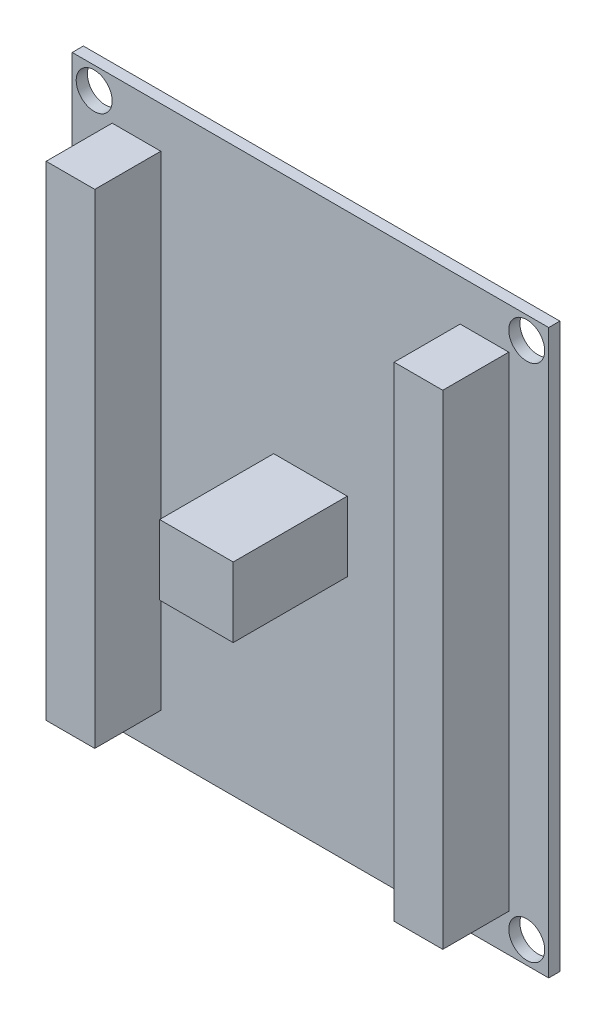
ISO-10303-21;
HEADER;
FILE_DESCRIPTION(('STEP AP214'),'2;1');
FILE_NAME('part.step','',(''),(''),'','','');
FILE_SCHEMA(('AUTOMOTIVE_DESIGN { 1 0 10303 214 1 1 1 1 }'));
ENDSEC;
DATA;
#1=APPLICATION_CONTEXT('core data for automotive mechanical design processes');
#2=APPLICATION_PROTOCOL_DEFINITION('international standard','automotive_design',2000,#1);
#3=PRODUCT_CONTEXT('',#1,'mechanical');
#4=PRODUCT('Part','Part','',(#3));
#5=PRODUCT_RELATED_PRODUCT_CATEGORY('part','',(#4));
#6=PRODUCT_DEFINITION_FORMATION('','',#4);
#7=PRODUCT_DEFINITION_CONTEXT('part definition',#1,'design');
#8=PRODUCT_DEFINITION('design','',#6,#7);
#9=PRODUCT_DEFINITION_SHAPE('','',#8);
#10=(LENGTH_UNIT() NAMED_UNIT(*) SI_UNIT(.MILLI.,.METRE.));
#11=(NAMED_UNIT(*) PLANE_ANGLE_UNIT() SI_UNIT($,.RADIAN.));
#12=(NAMED_UNIT(*) SI_UNIT($,.STERADIAN.) SOLID_ANGLE_UNIT());
#13=UNCERTAINTY_MEASURE_WITH_UNIT(LENGTH_MEASURE(1.E-05),#10,'distance_accuracy_value','');
#14=(GEOMETRIC_REPRESENTATION_CONTEXT(3) GLOBAL_UNCERTAINTY_ASSIGNED_CONTEXT((#13)) GLOBAL_UNIT_ASSIGNED_CONTEXT((#10,
#11,#12)) REPRESENTATION_CONTEXT('',''));
#15=CARTESIAN_POINT('',(0.,0.,0.));
#16=DIRECTION('',(0.,0.,1.));
#17=DIRECTION('',(1.,0.,0.));
#18=AXIS2_PLACEMENT_3D('',#15,#16,#17);
#19=CARTESIAN_POINT('',(0.,0.,1.55));
#20=DIRECTION('',(0.,0.,-1.));
#21=DIRECTION('',(-1.,0.,0.));
#22=AXIS2_PLACEMENT_3D('',#19,#20,#21);
#23=PLANE('',#22);
#24=DIRECTION('',(0.,1.,0.));
#25=VECTOR('',#24,1.);
#26=CARTESIAN_POINT('',(-5.11643955048181,0.,1.55));
#27=LINE('',#26,#25);
#28=CARTESIAN_POINT('',(-5.11643955048181,-4.85539671627351,1.55));
#29=VERTEX_POINT('',#28);
#30=CARTESIAN_POINT('',(-5.11643955048181,4.85539671627351,1.55));
#31=VERTEX_POINT('',#30);
#32=EDGE_CURVE('E64',#29,#31,#27,.T.);
#33=ORIENTED_EDGE('',*,*,#32,.T.);
#34=DIRECTION('',(1.,0.,0.));
#35=VECTOR('',#34,1.);
#36=CARTESIAN_POINT('',(0.,4.85539671627351,1.55));
#37=LINE('',#36,#35);
#38=CARTESIAN_POINT('',(5.11643955048181,4.85539671627351,1.55));
#39=VERTEX_POINT('',#38);
#40=EDGE_CURVE('E166',#31,#39,#37,.T.);
#41=ORIENTED_EDGE('',*,*,#40,.T.);
#42=DIRECTION('',(0.,1.,0.));
#43=VECTOR('',#42,1.);
#44=CARTESIAN_POINT('',(5.11643955048181,0.,1.55));
#45=LINE('',#44,#43);
#46=CARTESIAN_POINT('',(5.11643955048181,-4.85539671627351,1.55));
#47=VERTEX_POINT('',#46);
#48=EDGE_CURVE('E181',#47,#39,#45,.T.);
#49=ORIENTED_EDGE('',*,*,#48,.F.);
#50=DIRECTION('',(1.,0.,0.));
#51=VECTOR('',#50,1.);
#52=CARTESIAN_POINT('',(0.,-4.85539671627351,1.55));
#53=LINE('',#52,#51);
#54=EDGE_CURVE('E69',#29,#47,#53,.T.);
#55=ORIENTED_EDGE('',*,*,#54,.F.);
#56=EDGE_LOOP('',(#33,#41,#49,#55));
#57=FACE_BOUND('',#56,.T.);
#58=DIRECTION('',(0.,1.,0.));
#59=VECTOR('',#58,1.);
#60=CARTESIAN_POINT('',(33.13,-39.17,1.55));
#61=LINE('',#60,#59);
#62=CARTESIAN_POINT('',(33.13,-39.17,1.55));
#63=VERTEX_POINT('',#62);
#64=CARTESIAN_POINT('',(33.13,39.17,1.55));
#65=VERTEX_POINT('',#64);
#66=EDGE_CURVE('E319',#63,#65,#61,.T.);
#67=ORIENTED_EDGE('',*,*,#66,.T.);
#68=DIRECTION('',(-1.,0.,0.));
#69=VECTOR('',#68,1.);
#70=CARTESIAN_POINT('',(-33.13,39.17,1.55));
#71=LINE('',#70,#69);
#72=CARTESIAN_POINT('',(-33.13,39.17,1.55));
#73=VERTEX_POINT('',#72);
#74=EDGE_CURVE('E323',#65,#73,#71,.T.);
#75=ORIENTED_EDGE('',*,*,#74,.T.);
#76=DIRECTION('',(0.,-1.,0.));
#77=VECTOR('',#76,1.);
#78=CARTESIAN_POINT('',(-33.13,-39.17,1.55));
#79=LINE('',#78,#77);
#80=CARTESIAN_POINT('',(-33.13,-39.17,1.55));
#81=VERTEX_POINT('',#80);
#82=EDGE_CURVE('E327',#73,#81,#79,.T.);
#83=ORIENTED_EDGE('',*,*,#82,.T.);
#84=DIRECTION('',(1.,0.,0.));
#85=VECTOR('',#84,1.);
#86=CARTESIAN_POINT('',(-33.13,-39.17,1.55));
#87=LINE('',#86,#85);
#88=EDGE_CURVE('E330',#81,#63,#87,.T.);
#89=ORIENTED_EDGE('',*,*,#88,.T.);
#90=EDGE_LOOP('',(#67,#75,#83,#89));
#91=FACE_BOUND('',#90,.T.);
#92=CARTESIAN_POINT('',(-30.0764328508951,36.0901609219526,1.55));
#93=DIRECTION('',(0.,0.,1.));
#94=DIRECTION('',(1.,0.,0.));
#95=AXIS2_PLACEMENT_3D('',#92,#93,#94);
#96=CIRCLE('',#95,2.5);
#97=CARTESIAN_POINT('',(-27.5764328508951,36.0901609219526,1.55));
#98=VERTEX_POINT('',#97);
#99=EDGE_CURVE('E314',#98,#98,#96,.T.);
#100=ORIENTED_EDGE('',*,*,#99,.F.);
#101=EDGE_LOOP('',(#100));
#102=FACE_BOUND('',#101,.T.);
#103=CARTESIAN_POINT('',(-30.0764328508951,-36.07,1.55));
#104=DIRECTION('',(0.,0.,1.));
#105=DIRECTION('',(1.,0.,0.));
#106=AXIS2_PLACEMENT_3D('',#103,#104,#105);
#107=CIRCLE('',#106,2.5);
#108=CARTESIAN_POINT('',(-27.5764328508951,-36.07,1.55));
#109=VERTEX_POINT('',#108);
#110=EDGE_CURVE('E309',#109,#109,#107,.T.);
#111=ORIENTED_EDGE('',*,*,#110,.F.);
#112=EDGE_LOOP('',(#111));
#113=FACE_BOUND('',#112,.T.);
#114=CARTESIAN_POINT('',(30.0764328508951,36.0901609219526,1.55));
#115=DIRECTION('',(0.,0.,-1.));
#116=DIRECTION('',(-1.,0.,0.));
#117=AXIS2_PLACEMENT_3D('',#114,#115,#116);
#118=CIRCLE('',#117,2.5);
#119=CARTESIAN_POINT('',(27.5764328508951,36.0901609219526,1.55));
#120=VERTEX_POINT('',#119);
#121=EDGE_CURVE('E304',#120,#120,#118,.T.);
#122=ORIENTED_EDGE('',*,*,#121,.T.);
#123=EDGE_LOOP('',(#122));
#124=FACE_BOUND('',#123,.T.);
#125=CARTESIAN_POINT('',(30.0764328508951,-36.07,1.55));
#126=DIRECTION('',(0.,0.,-1.));
#127=DIRECTION('',(-1.,0.,0.));
#128=AXIS2_PLACEMENT_3D('',#125,#126,#127);
#129=CIRCLE('',#128,2.5);
#130=CARTESIAN_POINT('',(27.5764328508951,-36.07,1.55));
#131=VERTEX_POINT('',#130);
#132=EDGE_CURVE('E300',#131,#131,#129,.T.);
#133=ORIENTED_EDGE('',*,*,#132,.T.);
#134=EDGE_LOOP('',(#133));
#135=FACE_BOUND('',#134,.T.);
#136=DIRECTION('',(-1.,0.,0.));
#137=VECTOR('',#136,1.);
#138=CARTESIAN_POINT('',(0.,-33.91,1.55));
#139=LINE('',#138,#137);
#140=CARTESIAN_POINT('',(-20.8164328508951,-33.91,1.55));
#141=VERTEX_POINT('',#140);
#142=CARTESIAN_POINT('',(-27.5764328508951,-33.91,1.55));
#143=VERTEX_POINT('',#142);
#144=EDGE_CURVE('E277',#141,#143,#139,.T.);
#145=ORIENTED_EDGE('',*,*,#144,.T.);
#146=DIRECTION('',(0.,1.,0.));
#147=VECTOR('',#146,1.);
#148=CARTESIAN_POINT('',(-27.5764328508951,0.,1.55));
#149=LINE('',#148,#147);
#150=CARTESIAN_POINT('',(-27.5764328508951,33.43,1.55));
#151=VERTEX_POINT('',#150);
#152=EDGE_CURVE('E255',#143,#151,#149,.T.);
#153=ORIENTED_EDGE('',*,*,#152,.T.);
#154=DIRECTION('',(1.,0.,0.));
#155=VECTOR('',#154,1.);
#156=CARTESIAN_POINT('',(0.,33.43,1.55));
#157=LINE('',#156,#155);
#158=CARTESIAN_POINT('',(-20.8164328508951,33.43,1.55));
#159=VERTEX_POINT('',#158);
#160=EDGE_CURVE('E261',#151,#159,#157,.T.);
#161=ORIENTED_EDGE('',*,*,#160,.T.);
#162=DIRECTION('',(0.,-1.,0.));
#163=VECTOR('',#162,1.);
#164=CARTESIAN_POINT('',(-20.8164328508951,0.,1.55));
#165=LINE('',#164,#163);
#166=EDGE_CURVE('E281',#159,#141,#165,.T.);
#167=ORIENTED_EDGE('',*,*,#166,.T.);
#168=EDGE_LOOP('',(#145,#153,#161,#167));
#169=FACE_BOUND('',#168,.T.);
#170=DIRECTION('',(0.,1.,0.));
#171=VECTOR('',#170,1.);
#172=CARTESIAN_POINT('',(27.5764328508951,0.,1.55));
#173=LINE('',#172,#171);
#174=CARTESIAN_POINT('',(27.5764328508951,-33.91,1.55));
#175=VERTEX_POINT('',#174);
#176=CARTESIAN_POINT('',(27.5764328508951,33.43,1.55));
#177=VERTEX_POINT('',#176);
#178=EDGE_CURVE('E170',#175,#177,#173,.T.);
#179=ORIENTED_EDGE('',*,*,#178,.F.);
#180=DIRECTION('',(1.,0.,0.));
#181=VECTOR('',#180,1.);
#182=CARTESIAN_POINT('',(0.,-33.91,1.55));
#183=LINE('',#182,#181);
#184=CARTESIAN_POINT('',(20.8164328508951,-33.91,1.55));
#185=VERTEX_POINT('',#184);
#186=EDGE_CURVE('E216',#185,#175,#183,.T.);
#187=ORIENTED_EDGE('',*,*,#186,.F.);
#188=DIRECTION('',(0.,-1.,0.));
#189=VECTOR('',#188,1.);
#190=CARTESIAN_POINT('',(20.8164328508951,0.,1.55));
#191=LINE('',#190,#189);
#192=CARTESIAN_POINT('',(20.8164328508951,33.43,1.55));
#193=VERTEX_POINT('',#192);
#194=EDGE_CURVE('E233',#193,#185,#191,.T.);
#195=ORIENTED_EDGE('',*,*,#194,.F.);
#196=DIRECTION('',(-1.,0.,0.));
#197=VECTOR('',#196,1.);
#198=CARTESIAN_POINT('',(0.,33.43,1.55));
#199=LINE('',#198,#197);
#200=EDGE_CURVE('E229',#177,#193,#199,.T.);
#201=ORIENTED_EDGE('',*,*,#200,.F.);
#202=EDGE_LOOP('',(#179,#187,#195,#201));
#203=FACE_BOUND('',#202,.T.);
#204=ADVANCED_FACE('F46',(#57,#91,#102,#113,#124,#135,#169,#203),#23,.F.);
#205=CARTESIAN_POINT('',(33.13,-39.17,1.55));
#206=DIRECTION('',(-1.,0.,0.));
#207=DIRECTION('',(0.,0.,1.));
#208=AXIS2_PLACEMENT_3D('',#205,#206,#207);
#209=PLANE('',#208);
#210=DIRECTION('',(0.,1.,0.));
#211=VECTOR('',#210,1.);
#212=CARTESIAN_POINT('',(33.13,-39.17,0.));
#213=LINE('',#212,#211);
#214=CARTESIAN_POINT('',(33.13,-39.17,0.));
#215=VERTEX_POINT('',#214);
#216=CARTESIAN_POINT('',(33.13,39.17,0.));
#217=VERTEX_POINT('',#216);
#218=EDGE_CURVE('E334',#215,#217,#213,.T.);
#219=ORIENTED_EDGE('',*,*,#218,.T.);
#220=DIRECTION('',(0.,0.,-1.));
#221=VECTOR('',#220,1.);
#222=CARTESIAN_POINT('',(33.13,39.17,1.55));
#223=LINE('',#222,#221);
#224=EDGE_CURVE('E11',#65,#217,#223,.T.);
#225=ORIENTED_EDGE('',*,*,#224,.F.);
#226=ORIENTED_EDGE('',*,*,#66,.F.);
#227=DIRECTION('',(0.,0.,-1.));
#228=VECTOR('',#227,1.);
#229=CARTESIAN_POINT('',(33.13,-39.17,1.55));
#230=LINE('',#229,#228);
#231=EDGE_CURVE('E333',#63,#215,#230,.T.);
#232=ORIENTED_EDGE('',*,*,#231,.T.);
#233=EDGE_LOOP('',(#219,#225,#226,#232));
#234=FACE_BOUND('',#233,.T.);
#235=ADVANCED_FACE('F48',(#234),#209,.F.);
#236=CARTESIAN_POINT('',(-33.13,39.17,1.55));
#237=DIRECTION('',(0.,-1.,0.));
#238=DIRECTION('',(0.,0.,-1.));
#239=AXIS2_PLACEMENT_3D('',#236,#237,#238);
#240=PLANE('',#239);
#241=DIRECTION('',(-1.,0.,0.));
#242=VECTOR('',#241,1.);
#243=CARTESIAN_POINT('',(-33.13,39.17,0.));
#244=LINE('',#243,#242);
#245=CARTESIAN_POINT('',(-33.13,39.17,0.));
#246=VERTEX_POINT('',#245);
#247=EDGE_CURVE('E338',#217,#246,#244,.T.);
#248=ORIENTED_EDGE('',*,*,#247,.T.);
#249=DIRECTION('',(0.,0.,-1.));
#250=VECTOR('',#249,1.);
#251=CARTESIAN_POINT('',(-33.13,39.17,1.55));
#252=LINE('',#251,#250);
#253=EDGE_CURVE('E56',#73,#246,#252,.T.);
#254=ORIENTED_EDGE('',*,*,#253,.F.);
#255=ORIENTED_EDGE('',*,*,#74,.F.);
#256=ORIENTED_EDGE('',*,*,#224,.T.);
#257=EDGE_LOOP('',(#248,#254,#255,#256));
#258=FACE_BOUND('',#257,.T.);
#259=ADVANCED_FACE('F449',(#258),#240,.F.);
#260=CARTESIAN_POINT('',(-33.13,-39.17,1.55));
#261=DIRECTION('',(1.,0.,0.));
#262=DIRECTION('',(0.,0.,-1.));
#263=AXIS2_PLACEMENT_3D('',#260,#261,#262);
#264=PLANE('',#263);
#265=DIRECTION('',(0.,-1.,0.));
#266=VECTOR('',#265,1.);
#267=CARTESIAN_POINT('',(-33.13,-39.17,0.));
#268=LINE('',#267,#266);
#269=CARTESIAN_POINT('',(-33.13,-39.17,0.));
#270=VERTEX_POINT('',#269);
#271=EDGE_CURVE('E341',#246,#270,#268,.T.);
#272=ORIENTED_EDGE('',*,*,#271,.T.);
#273=DIRECTION('',(0.,0.,-1.));
#274=VECTOR('',#273,1.);
#275=CARTESIAN_POINT('',(-33.13,-39.17,1.55));
#276=LINE('',#275,#274);
#277=EDGE_CURVE('E349',#81,#270,#276,.T.);
#278=ORIENTED_EDGE('',*,*,#277,.F.);
#279=ORIENTED_EDGE('',*,*,#82,.F.);
#280=ORIENTED_EDGE('',*,*,#253,.T.);
#281=EDGE_LOOP('',(#272,#278,#279,#280));
#282=FACE_BOUND('',#281,.T.);
#283=ADVANCED_FACE('F446',(#282),#264,.F.);
#284=CARTESIAN_POINT('',(-33.13,-39.17,1.55));
#285=DIRECTION('',(0.,1.,0.));
#286=DIRECTION('',(0.,0.,1.));
#287=AXIS2_PLACEMENT_3D('',#284,#285,#286);
#288=PLANE('',#287);
#289=DIRECTION('',(1.,0.,0.));
#290=VECTOR('',#289,1.);
#291=CARTESIAN_POINT('',(-33.13,-39.17,0.));
#292=LINE('',#291,#290);
#293=EDGE_CURVE('E324',#270,#215,#292,.T.);
#294=ORIENTED_EDGE('',*,*,#293,.T.);
#295=ORIENTED_EDGE('',*,*,#231,.F.);
#296=ORIENTED_EDGE('',*,*,#88,.F.);
#297=ORIENTED_EDGE('',*,*,#277,.T.);
#298=EDGE_LOOP('',(#294,#295,#296,#297));
#299=FACE_BOUND('',#298,.T.);
#300=ADVANCED_FACE('F442',(#299),#288,.F.);
#301=CARTESIAN_POINT('',(0.,0.,0.));
#302=DIRECTION('',(0.,0.,-1.));
#303=DIRECTION('',(-1.,0.,0.));
#304=AXIS2_PLACEMENT_3D('',#301,#302,#303);
#305=PLANE('',#304);
#306=CARTESIAN_POINT('',(30.0764328508951,-36.07,0.));
#307=DIRECTION('',(0.,0.,-1.));
#308=DIRECTION('',(-1.,0.,0.));
#309=AXIS2_PLACEMENT_3D('',#306,#307,#308);
#310=CIRCLE('',#309,2.5);
#311=CARTESIAN_POINT('',(27.5764328508951,-36.07,0.));
#312=VERTEX_POINT('',#311);
#313=EDGE_CURVE('E50',#312,#312,#310,.F.);
#314=ORIENTED_EDGE('',*,*,#313,.T.);
#315=EDGE_LOOP('',(#314));
#316=FACE_BOUND('',#315,.T.);
#317=CARTESIAN_POINT('',(30.0764328508951,36.0901609219526,0.));
#318=DIRECTION('',(0.,0.,-1.));
#319=DIRECTION('',(-1.,0.,0.));
#320=AXIS2_PLACEMENT_3D('',#317,#318,#319);
#321=CIRCLE('',#320,2.5);
#322=CARTESIAN_POINT('',(27.5764328508951,36.0901609219526,0.));
#323=VERTEX_POINT('',#322);
#324=EDGE_CURVE('E308',#323,#323,#321,.F.);
#325=ORIENTED_EDGE('',*,*,#324,.T.);
#326=EDGE_LOOP('',(#325));
#327=FACE_BOUND('',#326,.T.);
#328=CARTESIAN_POINT('',(-30.0764328508951,-36.07,0.));
#329=DIRECTION('',(0.,0.,-1.));
#330=DIRECTION('',(-1.,0.,0.));
#331=AXIS2_PLACEMENT_3D('',#328,#329,#330);
#332=CIRCLE('',#331,2.5);
#333=CARTESIAN_POINT('',(-32.5764328508951,-36.07,0.));
#334=VERTEX_POINT('',#333);
#335=EDGE_CURVE('E313',#334,#334,#332,.T.);
#336=ORIENTED_EDGE('',*,*,#335,.F.);
#337=EDGE_LOOP('',(#336));
#338=FACE_BOUND('',#337,.T.);
#339=CARTESIAN_POINT('',(-30.0764328508951,36.0901609219526,0.));
#340=DIRECTION('',(0.,0.,-1.));
#341=DIRECTION('',(-1.,0.,0.));
#342=AXIS2_PLACEMENT_3D('',#339,#340,#341);
#343=CIRCLE('',#342,2.5);
#344=CARTESIAN_POINT('',(-32.5764328508951,36.0901609219526,0.));
#345=VERTEX_POINT('',#344);
#346=EDGE_CURVE('E318',#345,#345,#343,.T.);
#347=ORIENTED_EDGE('',*,*,#346,.F.);
#348=EDGE_LOOP('',(#347));
#349=FACE_BOUND('',#348,.T.);
#350=ORIENTED_EDGE('',*,*,#218,.F.);
#351=ORIENTED_EDGE('',*,*,#293,.F.);
#352=ORIENTED_EDGE('',*,*,#271,.F.);
#353=ORIENTED_EDGE('',*,*,#247,.F.);
#354=EDGE_LOOP('',(#350,#351,#352,#353));
#355=FACE_BOUND('',#354,.T.);
#356=ADVANCED_FACE('F365',(#316,#327,#338,#349,#355),#305,.T.);
#357=CARTESIAN_POINT('',(-30.0764328508951,36.0901609219526,-15.));
#358=DIRECTION('',(0.,0.,1.));
#359=DIRECTION('',(1.,0.,0.));
#360=AXIS2_PLACEMENT_3D('',#357,#358,#359);
#361=CYLINDRICAL_SURFACE('',#360,2.5);
#362=ORIENTED_EDGE('',*,*,#346,.T.);
#363=EDGE_LOOP('',(#362));
#364=FACE_BOUND('',#363,.T.);
#365=ORIENTED_EDGE('',*,*,#99,.T.);
#366=EDGE_LOOP('',(#365));
#367=FACE_BOUND('',#366,.T.);
#368=ADVANCED_FACE('F435',(#364,#367),#361,.F.);
#369=CARTESIAN_POINT('',(-30.0764328508951,-36.07,-15.));
#370=DIRECTION('',(0.,0.,1.));
#371=DIRECTION('',(1.,0.,0.));
#372=AXIS2_PLACEMENT_3D('',#369,#370,#371);
#373=CYLINDRICAL_SURFACE('',#372,2.5);
#374=ORIENTED_EDGE('',*,*,#335,.T.);
#375=EDGE_LOOP('',(#374));
#376=FACE_BOUND('',#375,.T.);
#377=ORIENTED_EDGE('',*,*,#110,.T.);
#378=EDGE_LOOP('',(#377));
#379=FACE_BOUND('',#378,.T.);
#380=ADVANCED_FACE('F372',(#376,#379),#373,.F.);
#381=CARTESIAN_POINT('',(30.0764328508951,36.0901609219526,-15.));
#382=DIRECTION('',(0.,0.,1.));
#383=DIRECTION('',(1.,0.,0.));
#384=AXIS2_PLACEMENT_3D('',#381,#382,#383);
#385=CYLINDRICAL_SURFACE('',#384,2.5);
#386=ORIENTED_EDGE('',*,*,#324,.F.);
#387=EDGE_LOOP('',(#386));
#388=FACE_BOUND('',#387,.T.);
#389=ORIENTED_EDGE('',*,*,#121,.F.);
#390=EDGE_LOOP('',(#389));
#391=FACE_BOUND('',#390,.T.);
#392=ADVANCED_FACE('F368',(#388,#391),#385,.F.);
#393=CARTESIAN_POINT('',(30.0764328508951,-36.07,-15.));
#394=DIRECTION('',(0.,0.,1.));
#395=DIRECTION('',(1.,0.,0.));
#396=AXIS2_PLACEMENT_3D('',#393,#394,#395);
#397=CYLINDRICAL_SURFACE('',#396,2.5);
#398=ORIENTED_EDGE('',*,*,#313,.F.);
#399=EDGE_LOOP('',(#398));
#400=FACE_BOUND('',#399,.T.);
#401=ORIENTED_EDGE('',*,*,#132,.F.);
#402=EDGE_LOOP('',(#401));
#403=FACE_BOUND('',#402,.T.);
#404=ADVANCED_FACE('F371',(#400,#403),#397,.F.);
#405=CARTESIAN_POINT('',(-27.5764328508951,0.,10.73));
#406=DIRECTION('',(-1.,0.,0.));
#407=DIRECTION('',(0.,0.,1.));
#408=AXIS2_PLACEMENT_3D('',#405,#406,#407);
#409=PLANE('',#408);
#410=ORIENTED_EDGE('',*,*,#152,.F.);
#411=DIRECTION('',(0.,0.,-1.));
#412=VECTOR('',#411,1.);
#413=CARTESIAN_POINT('',(-27.5764328508951,-33.91,10.73));
#414=LINE('',#413,#412);
#415=CARTESIAN_POINT('',(-27.5764328508951,-33.91,10.73));
#416=VERTEX_POINT('',#415);
#417=EDGE_CURVE('E297',#416,#143,#414,.T.);
#418=ORIENTED_EDGE('',*,*,#417,.F.);
#419=DIRECTION('',(0.,1.,0.));
#420=VECTOR('',#419,1.);
#421=CARTESIAN_POINT('',(-27.5764328508951,0.,10.73));
#422=LINE('',#421,#420);
#423=CARTESIAN_POINT('',(-27.5764328508951,33.43,10.73));
#424=VERTEX_POINT('',#423);
#425=EDGE_CURVE('E256',#416,#424,#422,.T.);
#426=ORIENTED_EDGE('',*,*,#425,.T.);
#427=DIRECTION('',(0.,0.,-1.));
#428=VECTOR('',#427,1.);
#429=CARTESIAN_POINT('',(-27.5764328508951,33.43,10.73));
#430=LINE('',#429,#428);
#431=EDGE_CURVE('E273',#424,#151,#430,.T.);
#432=ORIENTED_EDGE('',*,*,#431,.T.);
#433=EDGE_LOOP('',(#410,#418,#426,#432));
#434=FACE_BOUND('',#433,.T.);
#435=ADVANCED_FACE('F425',(#434),#409,.T.);
#436=CARTESIAN_POINT('',(0.,-33.91,10.73));
#437=DIRECTION('',(0.,-1.,0.));
#438=DIRECTION('',(0.,0.,-1.));
#439=AXIS2_PLACEMENT_3D('',#436,#437,#438);
#440=PLANE('',#439);
#441=ORIENTED_EDGE('',*,*,#144,.F.);
#442=DIRECTION('',(0.,0.,-1.));
#443=VECTOR('',#442,1.);
#444=CARTESIAN_POINT('',(-20.8164328508951,-33.91,10.73));
#445=LINE('',#444,#443);
#446=CARTESIAN_POINT('',(-20.8164328508951,-33.91,10.73));
#447=VERTEX_POINT('',#446);
#448=EDGE_CURVE('E294',#447,#141,#445,.T.);
#449=ORIENTED_EDGE('',*,*,#448,.F.);
#450=DIRECTION('',(-1.,0.,0.));
#451=VECTOR('',#450,1.);
#452=CARTESIAN_POINT('',(0.,-33.91,10.73));
#453=LINE('',#452,#451);
#454=EDGE_CURVE('E260',#447,#416,#453,.T.);
#455=ORIENTED_EDGE('',*,*,#454,.T.);
#456=ORIENTED_EDGE('',*,*,#417,.T.);
#457=EDGE_LOOP('',(#441,#449,#455,#456));
#458=FACE_BOUND('',#457,.T.);
#459=ADVANCED_FACE('F421',(#458),#440,.T.);
#460=CARTESIAN_POINT('',(-20.8164328508951,0.,10.73));
#461=DIRECTION('',(1.,0.,0.));
#462=DIRECTION('',(0.,0.,-1.));
#463=AXIS2_PLACEMENT_3D('',#460,#461,#462);
#464=PLANE('',#463);
#465=ORIENTED_EDGE('',*,*,#166,.F.);
#466=DIRECTION('',(0.,0.,-1.));
#467=VECTOR('',#466,1.);
#468=CARTESIAN_POINT('',(-20.8164328508951,33.43,10.73));
#469=LINE('',#468,#467);
#470=CARTESIAN_POINT('',(-20.8164328508951,33.43,10.73));
#471=VERTEX_POINT('',#470);
#472=EDGE_CURVE('E290',#471,#159,#469,.T.);
#473=ORIENTED_EDGE('',*,*,#472,.F.);
#474=DIRECTION('',(0.,-1.,0.));
#475=VECTOR('',#474,1.);
#476=CARTESIAN_POINT('',(-20.8164328508951,0.,10.73));
#477=LINE('',#476,#475);
#478=EDGE_CURVE('E265',#471,#447,#477,.T.);
#479=ORIENTED_EDGE('',*,*,#478,.T.);
#480=ORIENTED_EDGE('',*,*,#448,.T.);
#481=EDGE_LOOP('',(#465,#473,#479,#480));
#482=FACE_BOUND('',#481,.T.);
#483=ADVANCED_FACE('F417',(#482),#464,.T.);
#484=CARTESIAN_POINT('',(0.,33.43,10.73));
#485=DIRECTION('',(0.,1.,0.));
#486=DIRECTION('',(0.,0.,1.));
#487=AXIS2_PLACEMENT_3D('',#484,#485,#486);
#488=PLANE('',#487);
#489=ORIENTED_EDGE('',*,*,#160,.F.);
#490=ORIENTED_EDGE('',*,*,#431,.F.);
#491=DIRECTION('',(1.,0.,0.));
#492=VECTOR('',#491,1.);
#493=CARTESIAN_POINT('',(0.,33.43,10.73));
#494=LINE('',#493,#492);
#495=EDGE_CURVE('E269',#424,#471,#494,.T.);
#496=ORIENTED_EDGE('',*,*,#495,.T.);
#497=ORIENTED_EDGE('',*,*,#472,.T.);
#498=EDGE_LOOP('',(#489,#490,#496,#497));
#499=FACE_BOUND('',#498,.T.);
#500=ADVANCED_FACE('F413',(#499),#488,.T.);
#501=CARTESIAN_POINT('',(0.,0.,10.73));
#502=DIRECTION('',(0.,0.,1.));
#503=DIRECTION('',(1.,0.,0.));
#504=AXIS2_PLACEMENT_3D('',#501,#502,#503);
#505=PLANE('',#504);
#506=ORIENTED_EDGE('',*,*,#425,.F.);
#507=ORIENTED_EDGE('',*,*,#454,.F.);
#508=ORIENTED_EDGE('',*,*,#478,.F.);
#509=ORIENTED_EDGE('',*,*,#495,.F.);
#510=EDGE_LOOP('',(#506,#507,#508,#509));
#511=FACE_BOUND('',#510,.T.);
#512=ADVANCED_FACE('F407',(#511),#505,.T.);
#513=CARTESIAN_POINT('',(27.5764328508951,0.,10.73));
#514=DIRECTION('',(-1.,0.,0.));
#515=DIRECTION('',(0.,0.,1.));
#516=AXIS2_PLACEMENT_3D('',#513,#514,#515);
#517=PLANE('',#516);
#518=ORIENTED_EDGE('',*,*,#178,.T.);
#519=DIRECTION('',(0.,0.,-1.));
#520=VECTOR('',#519,1.);
#521=CARTESIAN_POINT('',(27.5764328508951,33.43,10.73));
#522=LINE('',#521,#520);
#523=CARTESIAN_POINT('',(27.5764328508951,33.43,10.73));
#524=VERTEX_POINT('',#523);
#525=EDGE_CURVE('E251',#524,#177,#522,.T.);
#526=ORIENTED_EDGE('',*,*,#525,.F.);
#527=DIRECTION('',(0.,1.,0.));
#528=VECTOR('',#527,1.);
#529=CARTESIAN_POINT('',(27.5764328508951,0.,10.73));
#530=LINE('',#529,#528);
#531=CARTESIAN_POINT('',(27.5764328508951,-33.91,10.73));
#532=VERTEX_POINT('',#531);
#533=EDGE_CURVE('E211',#532,#524,#530,.T.);
#534=ORIENTED_EDGE('',*,*,#533,.F.);
#535=DIRECTION('',(0.,0.,-1.));
#536=VECTOR('',#535,1.);
#537=CARTESIAN_POINT('',(27.5764328508951,-33.91,10.73));
#538=LINE('',#537,#536);
#539=EDGE_CURVE('E225',#532,#175,#538,.T.);
#540=ORIENTED_EDGE('',*,*,#539,.T.);
#541=EDGE_LOOP('',(#518,#526,#534,#540));
#542=FACE_BOUND('',#541,.T.);
#543=ADVANCED_FACE('F391',(#542),#517,.F.);
#544=CARTESIAN_POINT('',(0.,33.43,10.73));
#545=DIRECTION('',(0.,-1.,0.));
#546=DIRECTION('',(0.,0.,-1.));
#547=AXIS2_PLACEMENT_3D('',#544,#545,#546);
#548=PLANE('',#547);
#549=ORIENTED_EDGE('',*,*,#200,.T.);
#550=DIRECTION('',(0.,0.,-1.));
#551=VECTOR('',#550,1.);
#552=CARTESIAN_POINT('',(20.8164328508951,33.43,10.73));
#553=LINE('',#552,#551);
#554=CARTESIAN_POINT('',(20.8164328508951,33.43,10.73));
#555=VERTEX_POINT('',#554);
#556=EDGE_CURVE('E247',#555,#193,#553,.T.);
#557=ORIENTED_EDGE('',*,*,#556,.F.);
#558=DIRECTION('',(-1.,0.,0.));
#559=VECTOR('',#558,1.);
#560=CARTESIAN_POINT('',(0.,33.43,10.73));
#561=LINE('',#560,#559);
#562=EDGE_CURVE('E215',#524,#555,#561,.T.);
#563=ORIENTED_EDGE('',*,*,#562,.F.);
#564=ORIENTED_EDGE('',*,*,#525,.T.);
#565=EDGE_LOOP('',(#549,#557,#563,#564));
#566=FACE_BOUND('',#565,.T.);
#567=ADVANCED_FACE('F399',(#566),#548,.F.);
#568=CARTESIAN_POINT('',(20.8164328508951,0.,10.73));
#569=DIRECTION('',(1.,0.,0.));
#570=DIRECTION('',(0.,0.,-1.));
#571=AXIS2_PLACEMENT_3D('',#568,#569,#570);
#572=PLANE('',#571);
#573=ORIENTED_EDGE('',*,*,#194,.T.);
#574=DIRECTION('',(0.,0.,-1.));
#575=VECTOR('',#574,1.);
#576=CARTESIAN_POINT('',(20.8164328508951,-33.91,10.73));
#577=LINE('',#576,#575);
#578=CARTESIAN_POINT('',(20.8164328508951,-33.91,10.73));
#579=VERTEX_POINT('',#578);
#580=EDGE_CURVE('E243',#579,#185,#577,.T.);
#581=ORIENTED_EDGE('',*,*,#580,.F.);
#582=DIRECTION('',(0.,-1.,0.));
#583=VECTOR('',#582,1.);
#584=CARTESIAN_POINT('',(20.8164328508951,0.,10.73));
#585=LINE('',#584,#583);
#586=EDGE_CURVE('E219',#555,#579,#585,.T.);
#587=ORIENTED_EDGE('',*,*,#586,.F.);
#588=ORIENTED_EDGE('',*,*,#556,.T.);
#589=EDGE_LOOP('',(#573,#581,#587,#588));
#590=FACE_BOUND('',#589,.T.);
#591=ADVANCED_FACE('F397',(#590),#572,.F.);
#592=CARTESIAN_POINT('',(0.,-33.91,10.73));
#593=DIRECTION('',(0.,1.,0.));
#594=DIRECTION('',(0.,0.,1.));
#595=AXIS2_PLACEMENT_3D('',#592,#593,#594);
#596=PLANE('',#595);
#597=ORIENTED_EDGE('',*,*,#186,.T.);
#598=ORIENTED_EDGE('',*,*,#539,.F.);
#599=DIRECTION('',(1.,0.,0.));
#600=VECTOR('',#599,1.);
#601=CARTESIAN_POINT('',(0.,-33.91,10.73));
#602=LINE('',#601,#600);
#603=EDGE_CURVE('E222',#579,#532,#602,.T.);
#604=ORIENTED_EDGE('',*,*,#603,.F.);
#605=ORIENTED_EDGE('',*,*,#580,.T.);
#606=EDGE_LOOP('',(#597,#598,#604,#605));
#607=FACE_BOUND('',#606,.T.);
#608=ADVANCED_FACE('F387',(#607),#596,.F.);
#609=CARTESIAN_POINT('',(0.,0.,10.73));
#610=DIRECTION('',(0.,0.,1.));
#611=DIRECTION('',(-1.,0.,0.));
#612=AXIS2_PLACEMENT_3D('',#609,#610,#611);
#613=PLANE('',#612);
#614=ORIENTED_EDGE('',*,*,#533,.T.);
#615=ORIENTED_EDGE('',*,*,#562,.T.);
#616=ORIENTED_EDGE('',*,*,#586,.T.);
#617=ORIENTED_EDGE('',*,*,#603,.T.);
#618=EDGE_LOOP('',(#614,#615,#616,#617));
#619=FACE_BOUND('',#618,.T.);
#620=ADVANCED_FACE('F393',(#619),#613,.T.);
#621=CARTESIAN_POINT('',(0.,4.85539671627351,17.41));
#622=DIRECTION('',(0.,1.,0.));
#623=DIRECTION('',(0.,0.,1.));
#624=AXIS2_PLACEMENT_3D('',#621,#622,#623);
#625=PLANE('',#624);
#626=ORIENTED_EDGE('',*,*,#40,.F.);
#627=DIRECTION('',(0.,0.,-1.));
#628=VECTOR('',#627,1.);
#629=CARTESIAN_POINT('',(-5.11643955048181,4.85539671627351,17.41));
#630=LINE('',#629,#628);
#631=CARTESIAN_POINT('',(-5.11643955048181,4.85539671627351,17.41));
#632=VERTEX_POINT('',#631);
#633=EDGE_CURVE('E161',#632,#31,#630,.T.);
#634=ORIENTED_EDGE('',*,*,#633,.F.);
#635=DIRECTION('',(1.,0.,0.));
#636=VECTOR('',#635,1.);
#637=CARTESIAN_POINT('',(0.,4.85539671627351,17.41));
#638=LINE('',#637,#636);
#639=CARTESIAN_POINT('',(5.11643955048181,4.85539671627351,17.41));
#640=VERTEX_POINT('',#639);
#641=EDGE_CURVE('E165',#632,#640,#638,.T.);
#642=ORIENTED_EDGE('',*,*,#641,.T.);
#643=DIRECTION('',(0.,0.,-1.));
#644=VECTOR('',#643,1.);
#645=CARTESIAN_POINT('',(5.11643955048181,4.85539671627351,17.41));
#646=LINE('',#645,#644);
#647=EDGE_CURVE('E193',#640,#39,#646,.T.);
#648=ORIENTED_EDGE('',*,*,#647,.T.);
#649=EDGE_LOOP('',(#626,#634,#642,#648));
#650=FACE_BOUND('',#649,.T.);
#651=ADVANCED_FACE('F163',(#650),#625,.T.);
#652=CARTESIAN_POINT('',(-5.11643955048181,0.,17.41));
#653=DIRECTION('',(-1.,0.,0.));
#654=DIRECTION('',(0.,0.,1.));
#655=AXIS2_PLACEMENT_3D('',#652,#653,#654);
#656=PLANE('',#655);
#657=ORIENTED_EDGE('',*,*,#32,.F.);
#658=DIRECTION('',(0.,0.,-1.));
#659=VECTOR('',#658,1.);
#660=CARTESIAN_POINT('',(-5.11643955048181,-4.85539671627351,17.41));
#661=LINE('',#660,#659);
#662=CARTESIAN_POINT('',(-5.11643955048181,-4.85539671627351,17.41));
#663=VERTEX_POINT('',#662);
#664=EDGE_CURVE('E171',#663,#29,#661,.T.);
#665=ORIENTED_EDGE('',*,*,#664,.F.);
#666=DIRECTION('',(0.,1.,0.));
#667=VECTOR('',#666,1.);
#668=CARTESIAN_POINT('',(-5.11643955048181,0.,17.41));
#669=LINE('',#668,#667);
#670=EDGE_CURVE('E176',#663,#632,#669,.T.);
#671=ORIENTED_EDGE('',*,*,#670,.T.);
#672=ORIENTED_EDGE('',*,*,#633,.T.);
#673=EDGE_LOOP('',(#657,#665,#671,#672));
#674=FACE_BOUND('',#673,.T.);
#675=ADVANCED_FACE('F183',(#674),#656,.T.);
#676=CARTESIAN_POINT('',(0.,-4.85539671627351,17.41));
#677=DIRECTION('',(0.,1.,0.));
#678=DIRECTION('',(0.,0.,1.));
#679=AXIS2_PLACEMENT_3D('',#676,#677,#678);
#680=PLANE('',#679);
#681=ORIENTED_EDGE('',*,*,#54,.T.);
#682=DIRECTION('',(0.,0.,-1.));
#683=VECTOR('',#682,1.);
#684=CARTESIAN_POINT('',(5.11643955048181,-4.85539671627351,17.41));
#685=LINE('',#684,#683);
#686=CARTESIAN_POINT('',(5.11643955048181,-4.85539671627351,17.41));
#687=VERTEX_POINT('',#686);
#688=EDGE_CURVE('E205',#687,#47,#685,.T.);
#689=ORIENTED_EDGE('',*,*,#688,.F.);
#690=DIRECTION('',(1.,0.,0.));
#691=VECTOR('',#690,1.);
#692=CARTESIAN_POINT('',(0.,-4.85539671627351,17.41));
#693=LINE('',#692,#691);
#694=EDGE_CURVE('E186',#663,#687,#693,.T.);
#695=ORIENTED_EDGE('',*,*,#694,.F.);
#696=ORIENTED_EDGE('',*,*,#664,.T.);
#697=EDGE_LOOP('',(#681,#689,#695,#696));
#698=FACE_BOUND('',#697,.T.);
#699=ADVANCED_FACE('F613',(#698),#680,.F.);
#700=CARTESIAN_POINT('',(5.11643955048181,0.,17.41));
#701=DIRECTION('',(-1.,0.,0.));
#702=DIRECTION('',(0.,0.,1.));
#703=AXIS2_PLACEMENT_3D('',#700,#701,#702);
#704=PLANE('',#703);
#705=ORIENTED_EDGE('',*,*,#48,.T.);
#706=ORIENTED_EDGE('',*,*,#647,.F.);
#707=DIRECTION('',(0.,1.,0.));
#708=VECTOR('',#707,1.);
#709=CARTESIAN_POINT('',(5.11643955048181,0.,17.41));
#710=LINE('',#709,#708);
#711=EDGE_CURVE('E178',#687,#640,#710,.T.);
#712=ORIENTED_EDGE('',*,*,#711,.F.);
#713=ORIENTED_EDGE('',*,*,#688,.T.);
#714=EDGE_LOOP('',(#705,#706,#712,#713));
#715=FACE_BOUND('',#714,.T.);
#716=ADVANCED_FACE('F622',(#715),#704,.F.);
#717=CARTESIAN_POINT('',(0.,0.,17.41));
#718=DIRECTION('',(0.,0.,1.));
#719=DIRECTION('',(1.,0.,0.));
#720=AXIS2_PLACEMENT_3D('',#717,#718,#719);
#721=PLANE('',#720);
#722=ORIENTED_EDGE('',*,*,#641,.F.);
#723=ORIENTED_EDGE('',*,*,#670,.F.);
#724=ORIENTED_EDGE('',*,*,#694,.T.);
#725=ORIENTED_EDGE('',*,*,#711,.T.);
#726=EDGE_LOOP('',(#722,#723,#724,#725));
#727=FACE_BOUND('',#726,.T.);
#728=ADVANCED_FACE('F175',(#727),#721,.T.);
#729=CLOSED_SHELL('',(#204,#235,#259,#283,#300,#356,#368,#380,#392,#404,#435,#459,#483,#500,
#512,#543,#567,#591,#608,#620,#651,#675,#699,#716,#728));
#730=MANIFOLD_SOLID_BREP('B2',#729);
#731=ADVANCED_BREP_SHAPE_REPRESENTATION('',(#18,#730),#14);
#732=SHAPE_DEFINITION_REPRESENTATION(#9,#731);
ENDSEC;
END-ISO-10303-21;
